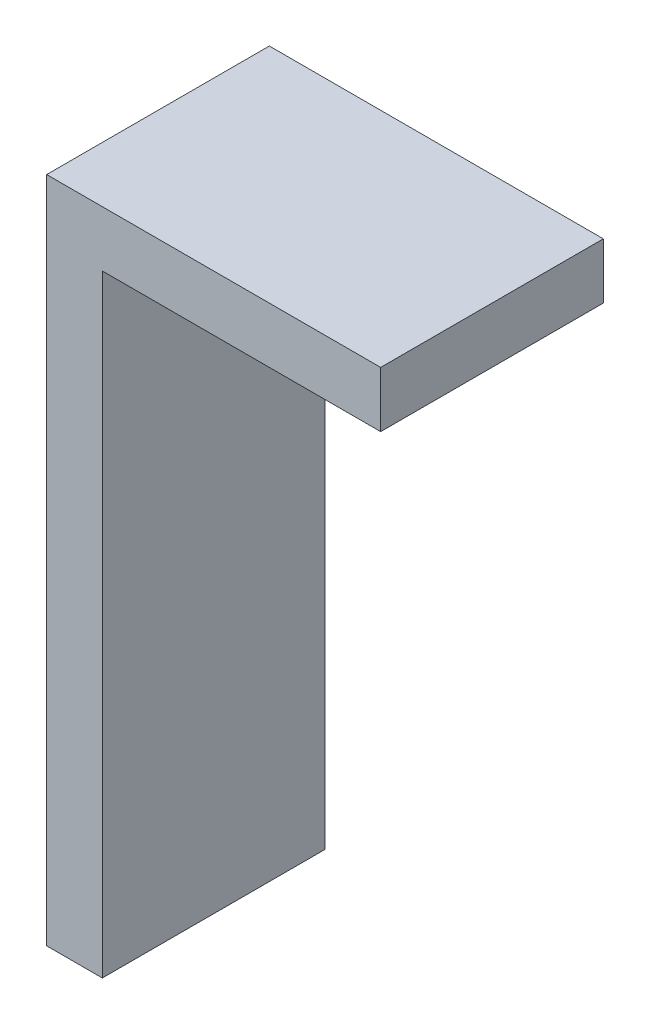
ISO-10303-21;
HEADER;
FILE_DESCRIPTION(('STEP AP214'),'2;1');
FILE_NAME('part.step','',(''),(''),'','','');
FILE_SCHEMA(('AUTOMOTIVE_DESIGN { 1 0 10303 214 1 1 1 1 }'));
ENDSEC;
DATA;
#1=APPLICATION_CONTEXT('core data for automotive mechanical design processes');
#2=APPLICATION_PROTOCOL_DEFINITION('international standard','automotive_design',2000,#1);
#3=PRODUCT_CONTEXT('',#1,'mechanical');
#4=PRODUCT('Part','Part','',(#3));
#5=PRODUCT_RELATED_PRODUCT_CATEGORY('part','',(#4));
#6=PRODUCT_DEFINITION_FORMATION('','',#4);
#7=PRODUCT_DEFINITION_CONTEXT('part definition',#1,'design');
#8=PRODUCT_DEFINITION('design','',#6,#7);
#9=PRODUCT_DEFINITION_SHAPE('','',#8);
#10=(LENGTH_UNIT() NAMED_UNIT(*) SI_UNIT(.MILLI.,.METRE.));
#11=(NAMED_UNIT(*) PLANE_ANGLE_UNIT() SI_UNIT($,.RADIAN.));
#12=(NAMED_UNIT(*) SI_UNIT($,.STERADIAN.) SOLID_ANGLE_UNIT());
#13=UNCERTAINTY_MEASURE_WITH_UNIT(LENGTH_MEASURE(1.E-05),#10,'distance_accuracy_value','');
#14=(GEOMETRIC_REPRESENTATION_CONTEXT(3) GLOBAL_UNCERTAINTY_ASSIGNED_CONTEXT((#13)) GLOBAL_UNIT_ASSIGNED_CONTEXT((#10,
#11,#12)) REPRESENTATION_CONTEXT('',''));
#15=CARTESIAN_POINT('',(0.,0.,0.));
#16=DIRECTION('',(0.,0.,1.));
#17=DIRECTION('',(1.,0.,0.));
#18=AXIS2_PLACEMENT_3D('',#15,#16,#17);
#19=CARTESIAN_POINT('',(3.175,76.2,12.7));
#20=DIRECTION('',(-1.,0.,0.));
#21=DIRECTION('',(0.,0.,1.));
#22=AXIS2_PLACEMENT_3D('',#19,#20,#21);
#23=PLANE('',#22);
#24=DIRECTION('',(0.,0.,-1.));
#25=VECTOR('',#24,1.);
#26=CARTESIAN_POINT('',(3.175,69.85,-12.7));
#27=LINE('',#26,#25);
#28=CARTESIAN_POINT('',(3.175,69.85,12.7));
#29=VERTEX_POINT('',#28);
#30=CARTESIAN_POINT('',(3.175,69.85,-12.7));
#31=VERTEX_POINT('',#30);
#32=EDGE_CURVE('E60',#29,#31,#27,.T.);
#33=ORIENTED_EDGE('',*,*,#32,.F.);
#34=DIRECTION('',(0.,-1.,0.));
#35=VECTOR('',#34,1.);
#36=CARTESIAN_POINT('',(3.175,76.2,12.7));
#37=LINE('',#36,#35);
#38=CARTESIAN_POINT('',(3.175,0.,12.7));
#39=VERTEX_POINT('',#38);
#40=EDGE_CURVE('E84',#29,#39,#37,.T.);
#41=ORIENTED_EDGE('',*,*,#40,.T.);
#42=DIRECTION('',(0.,0.,-1.));
#43=VECTOR('',#42,1.);
#44=CARTESIAN_POINT('',(3.175,0.,12.7));
#45=LINE('',#44,#43);
#46=CARTESIAN_POINT('',(3.175,0.,-12.7));
#47=VERTEX_POINT('',#46);
#48=EDGE_CURVE('E87',#39,#47,#45,.T.);
#49=ORIENTED_EDGE('',*,*,#48,.T.);
#50=DIRECTION('',(0.,-1.,0.));
#51=VECTOR('',#50,1.);
#52=CARTESIAN_POINT('',(3.175,76.2,-12.7));
#53=LINE('',#52,#51);
#54=EDGE_CURVE('E11',#31,#47,#53,.T.);
#55=ORIENTED_EDGE('',*,*,#54,.F.);
#56=EDGE_LOOP('',(#33,#41,#49,#55));
#57=FACE_BOUND('',#56,.T.);
#58=ADVANCED_FACE('F45',(#57),#23,.F.);
#59=CARTESIAN_POINT('',(-3.175,76.2,-12.7));
#60=DIRECTION('',(0.,0.,1.));
#61=DIRECTION('',(1.,0.,0.));
#62=AXIS2_PLACEMENT_3D('',#59,#60,#61);
#63=PLANE('',#62);
#64=DIRECTION('',(-1.,0.,0.));
#65=VECTOR('',#64,1.);
#66=CARTESIAN_POINT('',(-3.175,0.,-12.7));
#67=LINE('',#66,#65);
#68=CARTESIAN_POINT('',(-3.175,0.,-12.7));
#69=VERTEX_POINT('',#68);
#70=EDGE_CURVE('E108',#47,#69,#67,.T.);
#71=ORIENTED_EDGE('',*,*,#70,.T.);
#72=DIRECTION('',(0.,-1.,0.));
#73=VECTOR('',#72,1.);
#74=CARTESIAN_POINT('',(-3.175,76.2,-12.7));
#75=LINE('',#74,#73);
#76=CARTESIAN_POINT('',(-3.175,76.2,-12.7));
#77=VERTEX_POINT('',#76);
#78=EDGE_CURVE('E53',#77,#69,#75,.T.);
#79=ORIENTED_EDGE('',*,*,#78,.F.);
#80=DIRECTION('',(-1.,0.,0.));
#81=VECTOR('',#80,1.);
#82=CARTESIAN_POINT('',(-3.175,76.2,-12.7));
#83=LINE('',#82,#81);
#84=CARTESIAN_POINT('',(34.925,76.2,-12.7));
#85=VERTEX_POINT('',#84);
#86=EDGE_CURVE('E103',#85,#77,#83,.T.);
#87=ORIENTED_EDGE('',*,*,#86,.F.);
#88=DIRECTION('',(0.,1.,0.));
#89=VECTOR('',#88,1.);
#90=CARTESIAN_POINT('',(34.925,76.2,-12.7));
#91=LINE('',#90,#89);
#92=CARTESIAN_POINT('',(34.925,69.85,-12.7));
#93=VERTEX_POINT('',#92);
#94=EDGE_CURVE('E150',#93,#85,#91,.T.);
#95=ORIENTED_EDGE('',*,*,#94,.F.);
#96=DIRECTION('',(-1.,0.,0.));
#97=VECTOR('',#96,1.);
#98=CARTESIAN_POINT('',(34.925,69.85,-12.7));
#99=LINE('',#98,#97);
#100=EDGE_CURVE('E115',#93,#31,#99,.T.);
#101=ORIENTED_EDGE('',*,*,#100,.T.);
#102=ORIENTED_EDGE('',*,*,#54,.T.);
#103=EDGE_LOOP('',(#71,#79,#87,#95,#101,#102));
#104=FACE_BOUND('',#103,.T.);
#105=ADVANCED_FACE('F130',(#104),#63,.F.);
#106=CARTESIAN_POINT('',(-3.175,76.2,12.7));
#107=DIRECTION('',(1.,0.,0.));
#108=DIRECTION('',(0.,0.,-1.));
#109=AXIS2_PLACEMENT_3D('',#106,#107,#108);
#110=PLANE('',#109);
#111=DIRECTION('',(0.,0.,1.));
#112=VECTOR('',#111,1.);
#113=CARTESIAN_POINT('',(-3.175,0.,12.7));
#114=LINE('',#113,#112);
#115=CARTESIAN_POINT('',(-3.175,0.,12.7));
#116=VERTEX_POINT('',#115);
#117=EDGE_CURVE('E104',#69,#116,#114,.T.);
#118=ORIENTED_EDGE('',*,*,#117,.T.);
#119=DIRECTION('',(0.,-1.,0.));
#120=VECTOR('',#119,1.);
#121=CARTESIAN_POINT('',(-3.175,76.2,12.7));
#122=LINE('',#121,#120);
#123=CARTESIAN_POINT('',(-3.175,76.2,12.7));
#124=VERTEX_POINT('',#123);
#125=EDGE_CURVE('E92',#124,#116,#122,.T.);
#126=ORIENTED_EDGE('',*,*,#125,.F.);
#127=DIRECTION('',(0.,0.,1.));
#128=VECTOR('',#127,1.);
#129=CARTESIAN_POINT('',(-3.175,76.2,12.7));
#130=LINE('',#129,#128);
#131=EDGE_CURVE('E69',#77,#124,#130,.T.);
#132=ORIENTED_EDGE('',*,*,#131,.F.);
#133=ORIENTED_EDGE('',*,*,#78,.T.);
#134=EDGE_LOOP('',(#118,#126,#132,#133));
#135=FACE_BOUND('',#134,.T.);
#136=ADVANCED_FACE('F127',(#135),#110,.F.);
#137=CARTESIAN_POINT('',(-3.175,76.2,12.7));
#138=DIRECTION('',(0.,0.,-1.));
#139=DIRECTION('',(-1.,0.,0.));
#140=AXIS2_PLACEMENT_3D('',#137,#138,#139);
#141=PLANE('',#140);
#142=DIRECTION('',(1.,0.,0.));
#143=VECTOR('',#142,1.);
#144=CARTESIAN_POINT('',(-3.175,0.,12.7));
#145=LINE('',#144,#143);
#146=EDGE_CURVE('E97',#116,#39,#145,.T.);
#147=ORIENTED_EDGE('',*,*,#146,.T.);
#148=ORIENTED_EDGE('',*,*,#40,.F.);
#149=DIRECTION('',(-1.,0.,0.));
#150=VECTOR('',#149,1.);
#151=CARTESIAN_POINT('',(34.925,69.85,12.7));
#152=LINE('',#151,#150);
#153=CARTESIAN_POINT('',(34.925,69.85,12.7));
#154=VERTEX_POINT('',#153);
#155=EDGE_CURVE('E110',#154,#29,#152,.T.);
#156=ORIENTED_EDGE('',*,*,#155,.F.);
#157=DIRECTION('',(0.,-1.,0.));
#158=VECTOR('',#157,1.);
#159=CARTESIAN_POINT('',(34.925,69.85,12.7));
#160=LINE('',#159,#158);
#161=CARTESIAN_POINT('',(34.925,76.2,12.7));
#162=VERTEX_POINT('',#161);
#163=EDGE_CURVE('E146',#162,#154,#160,.T.);
#164=ORIENTED_EDGE('',*,*,#163,.F.);
#165=DIRECTION('',(1.,0.,0.));
#166=VECTOR('',#165,1.);
#167=CARTESIAN_POINT('',(-3.175,76.2,12.7));
#168=LINE('',#167,#166);
#169=EDGE_CURVE('E93',#124,#162,#168,.T.);
#170=ORIENTED_EDGE('',*,*,#169,.F.);
#171=ORIENTED_EDGE('',*,*,#125,.T.);
#172=EDGE_LOOP('',(#147,#148,#156,#164,#170,#171));
#173=FACE_BOUND('',#172,.T.);
#174=ADVANCED_FACE('F98',(#173),#141,.F.);
#175=CARTESIAN_POINT('',(0.,76.2,0.));
#176=DIRECTION('',(0.,-1.,0.));
#177=DIRECTION('',(0.,0.,-1.));
#178=AXIS2_PLACEMENT_3D('',#175,#176,#177);
#179=PLANE('',#178);
#180=ORIENTED_EDGE('',*,*,#169,.T.);
#181=DIRECTION('',(0.,0.,1.));
#182=VECTOR('',#181,1.);
#183=CARTESIAN_POINT('',(34.925,76.2,12.7));
#184=LINE('',#183,#182);
#185=EDGE_CURVE('E142',#85,#162,#184,.T.);
#186=ORIENTED_EDGE('',*,*,#185,.F.);
#187=ORIENTED_EDGE('',*,*,#86,.T.);
#188=ORIENTED_EDGE('',*,*,#131,.T.);
#189=EDGE_LOOP('',(#180,#186,#187,#188));
#190=FACE_BOUND('',#189,.T.);
#191=ADVANCED_FACE('F159',(#190),#179,.F.);
#192=CARTESIAN_POINT('',(0.,0.,0.));
#193=DIRECTION('',(0.,-1.,0.));
#194=DIRECTION('',(0.,0.,-1.));
#195=AXIS2_PLACEMENT_3D('',#192,#193,#194);
#196=PLANE('',#195);
#197=ORIENTED_EDGE('',*,*,#48,.F.);
#198=ORIENTED_EDGE('',*,*,#146,.F.);
#199=ORIENTED_EDGE('',*,*,#117,.F.);
#200=ORIENTED_EDGE('',*,*,#70,.F.);
#201=EDGE_LOOP('',(#197,#198,#199,#200));
#202=FACE_BOUND('',#201,.T.);
#203=ADVANCED_FACE('F107',(#202),#196,.T.);
#204=CARTESIAN_POINT('',(34.925,69.85,-12.7));
#205=DIRECTION('',(0.,1.,0.));
#206=DIRECTION('',(0.,0.,1.));
#207=AXIS2_PLACEMENT_3D('',#204,#205,#206);
#208=PLANE('',#207);
#209=ORIENTED_EDGE('',*,*,#32,.T.);
#210=ORIENTED_EDGE('',*,*,#100,.F.);
#211=DIRECTION('',(0.,0.,-1.));
#212=VECTOR('',#211,1.);
#213=CARTESIAN_POINT('',(34.925,69.85,-12.7));
#214=LINE('',#213,#212);
#215=EDGE_CURVE('E166',#154,#93,#214,.T.);
#216=ORIENTED_EDGE('',*,*,#215,.F.);
#217=ORIENTED_EDGE('',*,*,#155,.T.);
#218=EDGE_LOOP('',(#209,#210,#216,#217));
#219=FACE_BOUND('',#218,.T.);
#220=ADVANCED_FACE('F138',(#219),#208,.F.);
#221=CARTESIAN_POINT('',(34.925,0.,0.));
#222=DIRECTION('',(-1.,0.,0.));
#223=DIRECTION('',(0.,0.,1.));
#224=AXIS2_PLACEMENT_3D('',#221,#222,#223);
#225=PLANE('',#224);
#226=ORIENTED_EDGE('',*,*,#185,.T.);
#227=ORIENTED_EDGE('',*,*,#163,.T.);
#228=ORIENTED_EDGE('',*,*,#215,.T.);
#229=ORIENTED_EDGE('',*,*,#94,.T.);
#230=EDGE_LOOP('',(#226,#227,#228,#229));
#231=FACE_BOUND('',#230,.T.);
#232=ADVANCED_FACE('F168',(#231),#225,.F.);
#233=CLOSED_SHELL('',(#58,#105,#136,#174,#191,#203,#220,#232));
#234=MANIFOLD_SOLID_BREP('B2',#233);
#235=ADVANCED_BREP_SHAPE_REPRESENTATION('',(#18,#234),#14);
#236=SHAPE_DEFINITION_REPRESENTATION(#9,#235);
ENDSEC;
END-ISO-10303-21;
